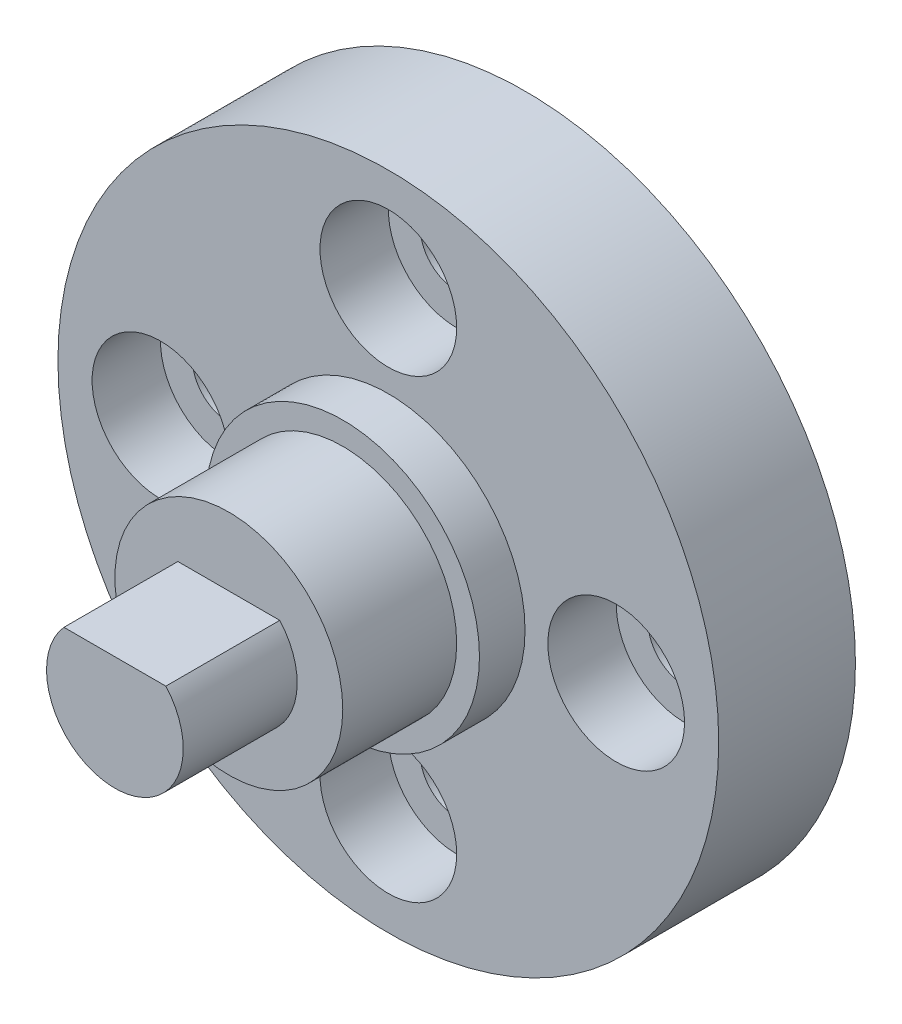
ISO-10303-21;
HEADER;
FILE_DESCRIPTION(('STEP AP214'),'2;1');
FILE_NAME('part.step','',(''),(''),'','','');
FILE_SCHEMA(('AUTOMOTIVE_DESIGN { 1 0 10303 214 1 1 1 1 }'));
ENDSEC;
DATA;
#1=APPLICATION_CONTEXT('core data for automotive mechanical design processes');
#2=APPLICATION_PROTOCOL_DEFINITION('international standard','automotive_design',2000,#1);
#3=PRODUCT_CONTEXT('',#1,'mechanical');
#4=PRODUCT('Part','Part','',(#3));
#5=PRODUCT_RELATED_PRODUCT_CATEGORY('part','',(#4));
#6=PRODUCT_DEFINITION_FORMATION('','',#4);
#7=PRODUCT_DEFINITION_CONTEXT('part definition',#1,'design');
#8=PRODUCT_DEFINITION('design','',#6,#7);
#9=PRODUCT_DEFINITION_SHAPE('','',#8);
#10=(LENGTH_UNIT() NAMED_UNIT(*) SI_UNIT(.MILLI.,.METRE.));
#11=(NAMED_UNIT(*) PLANE_ANGLE_UNIT() SI_UNIT($,.RADIAN.));
#12=(NAMED_UNIT(*) SI_UNIT($,.STERADIAN.) SOLID_ANGLE_UNIT());
#13=UNCERTAINTY_MEASURE_WITH_UNIT(LENGTH_MEASURE(1.E-05),#10,'distance_accuracy_value','');
#14=(GEOMETRIC_REPRESENTATION_CONTEXT(3) GLOBAL_UNCERTAINTY_ASSIGNED_CONTEXT((#13)) GLOBAL_UNIT_ASSIGNED_CONTEXT((#10,
#11,#12)) REPRESENTATION_CONTEXT('',''));
#15=CARTESIAN_POINT('',(0.,0.,0.));
#16=DIRECTION('',(0.,0.,1.));
#17=DIRECTION('',(1.,0.,0.));
#18=AXIS2_PLACEMENT_3D('',#15,#16,#17);
#19=CARTESIAN_POINT('',(0.,10.,6.));
#20=DIRECTION('',(0.,0.,-1.));
#21=DIRECTION('',(-1.,0.,0.));
#22=AXIS2_PLACEMENT_3D('',#19,#20,#21);
#23=CYLINDRICAL_SURFACE('',#22,1.6);
#24=CARTESIAN_POINT('',(0.,10.,0.));
#25=DIRECTION('',(0.,0.,1.));
#26=DIRECTION('',(1.,0.,0.));
#27=AXIS2_PLACEMENT_3D('',#24,#25,#26);
#28=CIRCLE('',#27,1.6);
#29=CARTESIAN_POINT('',(1.6,10.,0.));
#30=VERTEX_POINT('',#29);
#31=EDGE_CURVE('E11',#30,#30,#28,.T.);
#32=ORIENTED_EDGE('',*,*,#31,.F.);
#33=EDGE_LOOP('',(#32));
#34=FACE_BOUND('',#33,.T.);
#35=CARTESIAN_POINT('',(0.,10.,3.));
#36=DIRECTION('',(0.,0.,1.));
#37=DIRECTION('',(1.,0.,0.));
#38=AXIS2_PLACEMENT_3D('',#35,#36,#37);
#39=CIRCLE('',#38,1.6);
#40=CARTESIAN_POINT('',(1.6,10.,3.));
#41=VERTEX_POINT('',#40);
#42=EDGE_CURVE('E24',#41,#41,#39,.T.);
#43=ORIENTED_EDGE('',*,*,#42,.T.);
#44=EDGE_LOOP('',(#43));
#45=FACE_BOUND('',#44,.T.);
#46=ADVANCED_FACE('F17',(#34,#45),#23,.F.);
#47=CARTESIAN_POINT('',(10.,0.,6.));
#48=DIRECTION('',(0.,0.,-1.));
#49=DIRECTION('',(-1.,0.,0.));
#50=AXIS2_PLACEMENT_3D('',#47,#48,#49);
#51=CYLINDRICAL_SURFACE('',#50,1.6);
#52=CARTESIAN_POINT('',(10.,0.,0.));
#53=DIRECTION('',(0.,0.,1.));
#54=DIRECTION('',(1.,0.,0.));
#55=AXIS2_PLACEMENT_3D('',#52,#53,#54);
#56=CIRCLE('',#55,1.6);
#57=CARTESIAN_POINT('',(11.6,0.,0.));
#58=VERTEX_POINT('',#57);
#59=EDGE_CURVE('E119',#58,#58,#56,.T.);
#60=ORIENTED_EDGE('',*,*,#59,.F.);
#61=EDGE_LOOP('',(#60));
#62=FACE_BOUND('',#61,.T.);
#63=CARTESIAN_POINT('',(10.,0.,3.));
#64=DIRECTION('',(0.,0.,1.));
#65=DIRECTION('',(1.,0.,0.));
#66=AXIS2_PLACEMENT_3D('',#63,#64,#65);
#67=CIRCLE('',#66,1.6);
#68=CARTESIAN_POINT('',(11.6,0.,3.));
#69=VERTEX_POINT('',#68);
#70=EDGE_CURVE('E116',#69,#69,#67,.T.);
#71=ORIENTED_EDGE('',*,*,#70,.T.);
#72=EDGE_LOOP('',(#71));
#73=FACE_BOUND('',#72,.T.);
#74=ADVANCED_FACE('F197',(#62,#73),#51,.F.);
#75=CARTESIAN_POINT('',(0.,-10.,6.));
#76=DIRECTION('',(0.,0.,-1.));
#77=DIRECTION('',(-1.,0.,0.));
#78=AXIS2_PLACEMENT_3D('',#75,#76,#77);
#79=CYLINDRICAL_SURFACE('',#78,1.6);
#80=CARTESIAN_POINT('',(0.,-10.,0.));
#81=DIRECTION('',(0.,0.,1.));
#82=DIRECTION('',(1.,0.,0.));
#83=AXIS2_PLACEMENT_3D('',#80,#81,#82);
#84=CIRCLE('',#83,1.6);
#85=CARTESIAN_POINT('',(1.6,-10.,0.));
#86=VERTEX_POINT('',#85);
#87=EDGE_CURVE('E113',#86,#86,#84,.T.);
#88=ORIENTED_EDGE('',*,*,#87,.F.);
#89=EDGE_LOOP('',(#88));
#90=FACE_BOUND('',#89,.T.);
#91=CARTESIAN_POINT('',(0.,-10.,3.));
#92=DIRECTION('',(0.,0.,1.));
#93=DIRECTION('',(1.,0.,0.));
#94=AXIS2_PLACEMENT_3D('',#91,#92,#93);
#95=CIRCLE('',#94,1.6);
#96=CARTESIAN_POINT('',(1.6,-10.,3.));
#97=VERTEX_POINT('',#96);
#98=EDGE_CURVE('E110',#97,#97,#95,.T.);
#99=ORIENTED_EDGE('',*,*,#98,.T.);
#100=EDGE_LOOP('',(#99));
#101=FACE_BOUND('',#100,.T.);
#102=ADVANCED_FACE('F174',(#90,#101),#79,.F.);
#103=CARTESIAN_POINT('',(-10.,0.,6.));
#104=DIRECTION('',(0.,0.,-1.));
#105=DIRECTION('',(-1.,0.,0.));
#106=AXIS2_PLACEMENT_3D('',#103,#104,#105);
#107=CYLINDRICAL_SURFACE('',#106,1.6);
#108=CARTESIAN_POINT('',(-10.,0.,0.));
#109=DIRECTION('',(0.,0.,1.));
#110=DIRECTION('',(1.,0.,0.));
#111=AXIS2_PLACEMENT_3D('',#108,#109,#110);
#112=CIRCLE('',#111,1.6);
#113=CARTESIAN_POINT('',(-8.4,0.,0.));
#114=VERTEX_POINT('',#113);
#115=EDGE_CURVE('E107',#114,#114,#112,.T.);
#116=ORIENTED_EDGE('',*,*,#115,.F.);
#117=EDGE_LOOP('',(#116));
#118=FACE_BOUND('',#117,.T.);
#119=CARTESIAN_POINT('',(-10.,0.,3.));
#120=DIRECTION('',(0.,0.,1.));
#121=DIRECTION('',(1.,0.,0.));
#122=AXIS2_PLACEMENT_3D('',#119,#120,#121);
#123=CIRCLE('',#122,1.6);
#124=CARTESIAN_POINT('',(-8.4,0.,3.));
#125=VERTEX_POINT('',#124);
#126=EDGE_CURVE('E104',#125,#125,#123,.T.);
#127=ORIENTED_EDGE('',*,*,#126,.T.);
#128=EDGE_LOOP('',(#127));
#129=FACE_BOUND('',#128,.T.);
#130=ADVANCED_FACE('F142',(#118,#129),#107,.F.);
#131=CARTESIAN_POINT('',(0.,0.,6.));
#132=DIRECTION('',(0.,0.,1.));
#133=DIRECTION('',(1.,0.,0.));
#134=AXIS2_PLACEMENT_3D('',#131,#132,#133);
#135=PLANE('',#134);
#136=CARTESIAN_POINT('',(0.,10.,6.));
#137=DIRECTION('',(0.,0.,1.));
#138=DIRECTION('',(1.,0.,0.));
#139=AXIS2_PLACEMENT_3D('',#136,#137,#138);
#140=CIRCLE('',#139,3.);
#141=CARTESIAN_POINT('',(3.,10.,6.));
#142=VERTEX_POINT('',#141);
#143=EDGE_CURVE('E101',#142,#142,#140,.T.);
#144=ORIENTED_EDGE('',*,*,#143,.F.);
#145=EDGE_LOOP('',(#144));
#146=FACE_BOUND('',#145,.T.);
#147=CARTESIAN_POINT('',(10.,0.,6.));
#148=DIRECTION('',(0.,0.,1.));
#149=DIRECTION('',(1.,0.,0.));
#150=AXIS2_PLACEMENT_3D('',#147,#148,#149);
#151=CIRCLE('',#150,3.);
#152=CARTESIAN_POINT('',(13.,0.,6.));
#153=VERTEX_POINT('',#152);
#154=EDGE_CURVE('E98',#153,#153,#151,.T.);
#155=ORIENTED_EDGE('',*,*,#154,.F.);
#156=EDGE_LOOP('',(#155));
#157=FACE_BOUND('',#156,.T.);
#158=CARTESIAN_POINT('',(0.,-10.,6.));
#159=DIRECTION('',(0.,0.,1.));
#160=DIRECTION('',(1.,0.,0.));
#161=AXIS2_PLACEMENT_3D('',#158,#159,#160);
#162=CIRCLE('',#161,3.);
#163=CARTESIAN_POINT('',(3.,-10.,6.));
#164=VERTEX_POINT('',#163);
#165=EDGE_CURVE('E95',#164,#164,#162,.T.);
#166=ORIENTED_EDGE('',*,*,#165,.F.);
#167=EDGE_LOOP('',(#166));
#168=FACE_BOUND('',#167,.T.);
#169=CARTESIAN_POINT('',(-10.,0.,6.));
#170=DIRECTION('',(0.,0.,1.));
#171=DIRECTION('',(1.,0.,0.));
#172=AXIS2_PLACEMENT_3D('',#169,#170,#171);
#173=CIRCLE('',#172,3.);
#174=CARTESIAN_POINT('',(-7.,0.,6.));
#175=VERTEX_POINT('',#174);
#176=EDGE_CURVE('E92',#175,#175,#173,.T.);
#177=ORIENTED_EDGE('',*,*,#176,.F.);
#178=EDGE_LOOP('',(#177));
#179=FACE_BOUND('',#178,.T.);
#180=CARTESIAN_POINT('',(0.,0.,6.));
#181=DIRECTION('',(0.,0.,1.));
#182=DIRECTION('',(1.,0.,0.));
#183=AXIS2_PLACEMENT_3D('',#180,#181,#182);
#184=CIRCLE('',#183,6.);
#185=CARTESIAN_POINT('',(6.,0.,6.));
#186=VERTEX_POINT('',#185);
#187=EDGE_CURVE('E89',#186,#186,#184,.T.);
#188=ORIENTED_EDGE('',*,*,#187,.F.);
#189=EDGE_LOOP('',(#188));
#190=FACE_BOUND('',#189,.T.);
#191=CARTESIAN_POINT('',(0.,0.,6.));
#192=DIRECTION('',(0.,0.,1.));
#193=DIRECTION('',(1.,0.,0.));
#194=AXIS2_PLACEMENT_3D('',#191,#192,#193);
#195=CIRCLE('',#194,14.5);
#196=CARTESIAN_POINT('',(14.5,0.,6.));
#197=VERTEX_POINT('',#196);
#198=EDGE_CURVE('E86',#197,#197,#195,.T.);
#199=ORIENTED_EDGE('',*,*,#198,.T.);
#200=EDGE_LOOP('',(#199));
#201=FACE_BOUND('',#200,.T.);
#202=ADVANCED_FACE('F138',(#146,#157,#168,#179,#190,#201),#135,.T.);
#203=CARTESIAN_POINT('',(0.,0.,0.));
#204=DIRECTION('',(0.,0.,1.));
#205=DIRECTION('',(1.,0.,0.));
#206=AXIS2_PLACEMENT_3D('',#203,#204,#205);
#207=PLANE('',#206);
#208=CARTESIAN_POINT('',(0.,0.,0.));
#209=DIRECTION('',(0.,0.,1.));
#210=DIRECTION('',(1.,0.,0.));
#211=AXIS2_PLACEMENT_3D('',#208,#209,#210);
#212=CIRCLE('',#211,14.5);
#213=CARTESIAN_POINT('',(14.5,0.,0.));
#214=VERTEX_POINT('',#213);
#215=EDGE_CURVE('E83',#214,#214,#212,.T.);
#216=ORIENTED_EDGE('',*,*,#215,.F.);
#217=EDGE_LOOP('',(#216));
#218=FACE_BOUND('',#217,.T.);
#219=ORIENTED_EDGE('',*,*,#31,.T.);
#220=EDGE_LOOP('',(#219));
#221=FACE_BOUND('',#220,.T.);
#222=ORIENTED_EDGE('',*,*,#59,.T.);
#223=EDGE_LOOP('',(#222));
#224=FACE_BOUND('',#223,.T.);
#225=ORIENTED_EDGE('',*,*,#87,.T.);
#226=EDGE_LOOP('',(#225));
#227=FACE_BOUND('',#226,.T.);
#228=ORIENTED_EDGE('',*,*,#115,.T.);
#229=EDGE_LOOP('',(#228));
#230=FACE_BOUND('',#229,.T.);
#231=ADVANCED_FACE('F141',(#218,#221,#224,#227,#230),#207,.F.);
#232=CARTESIAN_POINT('',(0.,0.,6.));
#233=DIRECTION('',(0.,0.,-1.));
#234=DIRECTION('',(-1.,0.,0.));
#235=AXIS2_PLACEMENT_3D('',#232,#233,#234);
#236=CYLINDRICAL_SURFACE('',#235,14.5);
#237=ORIENTED_EDGE('',*,*,#198,.F.);
#238=EDGE_LOOP('',(#237));
#239=FACE_BOUND('',#238,.T.);
#240=ORIENTED_EDGE('',*,*,#215,.T.);
#241=EDGE_LOOP('',(#240));
#242=FACE_BOUND('',#241,.T.);
#243=ADVANCED_FACE('F154',(#239,#242),#236,.T.);
#244=CARTESIAN_POINT('',(0.,0.,8.));
#245=DIRECTION('',(0.,0.,-1.));
#246=DIRECTION('',(-1.,0.,0.));
#247=AXIS2_PLACEMENT_3D('',#244,#245,#246);
#248=CYLINDRICAL_SURFACE('',#247,6.);
#249=CARTESIAN_POINT('',(0.,0.,8.));
#250=DIRECTION('',(0.,0.,1.));
#251=DIRECTION('',(1.,0.,0.));
#252=AXIS2_PLACEMENT_3D('',#249,#250,#251);
#253=CIRCLE('',#252,6.);
#254=CARTESIAN_POINT('',(6.,0.,8.));
#255=VERTEX_POINT('',#254);
#256=EDGE_CURVE('E80',#255,#255,#253,.T.);
#257=ORIENTED_EDGE('',*,*,#256,.F.);
#258=EDGE_LOOP('',(#257));
#259=FACE_BOUND('',#258,.T.);
#260=ORIENTED_EDGE('',*,*,#187,.T.);
#261=EDGE_LOOP('',(#260));
#262=FACE_BOUND('',#261,.T.);
#263=ADVANCED_FACE('F157',(#259,#262),#248,.T.);
#264=CARTESIAN_POINT('',(0.,0.,8.));
#265=DIRECTION('',(0.,0.,1.));
#266=DIRECTION('',(1.,0.,0.));
#267=AXIS2_PLACEMENT_3D('',#264,#265,#266);
#268=PLANE('',#267);
#269=CARTESIAN_POINT('',(0.,0.,8.));
#270=DIRECTION('',(0.,0.,1.));
#271=DIRECTION('',(1.,0.,0.));
#272=AXIS2_PLACEMENT_3D('',#269,#270,#271);
#273=CIRCLE('',#272,5.);
#274=CARTESIAN_POINT('',(5.,0.,8.));
#275=VERTEX_POINT('',#274);
#276=EDGE_CURVE('E77',#275,#275,#273,.T.);
#277=ORIENTED_EDGE('',*,*,#276,.F.);
#278=EDGE_LOOP('',(#277));
#279=FACE_BOUND('',#278,.T.);
#280=ORIENTED_EDGE('',*,*,#256,.T.);
#281=EDGE_LOOP('',(#280));
#282=FACE_BOUND('',#281,.T.);
#283=ADVANCED_FACE('F212',(#279,#282),#268,.T.);
#284=CARTESIAN_POINT('',(0.,0.,13.));
#285=DIRECTION('',(0.,0.,-1.));
#286=DIRECTION('',(-1.,0.,0.));
#287=AXIS2_PLACEMENT_3D('',#284,#285,#286);
#288=CYLINDRICAL_SURFACE('',#287,5.);
#289=CARTESIAN_POINT('',(0.,0.,13.));
#290=DIRECTION('',(0.,0.,1.));
#291=DIRECTION('',(1.,0.,0.));
#292=AXIS2_PLACEMENT_3D('',#289,#290,#291);
#293=CIRCLE('',#292,5.);
#294=CARTESIAN_POINT('',(5.,0.,13.));
#295=VERTEX_POINT('',#294);
#296=EDGE_CURVE('E74',#295,#295,#293,.T.);
#297=ORIENTED_EDGE('',*,*,#296,.F.);
#298=EDGE_LOOP('',(#297));
#299=FACE_BOUND('',#298,.T.);
#300=ORIENTED_EDGE('',*,*,#276,.T.);
#301=EDGE_LOOP('',(#300));
#302=FACE_BOUND('',#301,.T.);
#303=ADVANCED_FACE('F194',(#299,#302),#288,.T.);
#304=CARTESIAN_POINT('',(0.,0.,13.));
#305=DIRECTION('',(0.,0.,1.));
#306=DIRECTION('',(1.,0.,0.));
#307=AXIS2_PLACEMENT_3D('',#304,#305,#306);
#308=PLANE('',#307);
#309=CARTESIAN_POINT('',(0.,0.,13.));
#310=DIRECTION('',(0.,0.,1.));
#311=DIRECTION('',(1.,0.,0.));
#312=AXIS2_PLACEMENT_3D('',#309,#310,#311);
#313=CIRCLE('',#312,3.);
#314=CARTESIAN_POINT('',(-2.23606797749979,2.,13.));
#315=VERTEX_POINT('',#314);
#316=CARTESIAN_POINT('',(2.23606797749979,2.,13.));
#317=VERTEX_POINT('',#316);
#318=EDGE_CURVE('E30',#315,#317,#313,.T.);
#319=ORIENTED_EDGE('',*,*,#318,.F.);
#320=DIRECTION('',(-1.,0.,0.));
#321=VECTOR('',#320,1.);
#322=CARTESIAN_POINT('',(2.23606797749979,2.,13.));
#323=LINE('',#322,#321);
#324=EDGE_CURVE('E34',#317,#315,#323,.T.);
#325=ORIENTED_EDGE('',*,*,#324,.F.);
#326=EDGE_LOOP('',(#319,#325));
#327=FACE_BOUND('',#326,.T.);
#328=ORIENTED_EDGE('',*,*,#296,.T.);
#329=EDGE_LOOP('',(#328));
#330=FACE_BOUND('',#329,.T.);
#331=ADVANCED_FACE('F188',(#327,#330),#308,.T.);
#332=CARTESIAN_POINT('',(-10.,0.,3.));
#333=DIRECTION('',(0.,0.,1.));
#334=DIRECTION('',(1.,0.,0.));
#335=AXIS2_PLACEMENT_3D('',#332,#333,#334);
#336=CYLINDRICAL_SURFACE('',#335,3.);
#337=CARTESIAN_POINT('',(-10.,0.,3.));
#338=DIRECTION('',(0.,0.,1.));
#339=DIRECTION('',(1.,0.,0.));
#340=AXIS2_PLACEMENT_3D('',#337,#338,#339);
#341=CIRCLE('',#340,3.);
#342=CARTESIAN_POINT('',(-7.,0.,3.));
#343=VERTEX_POINT('',#342);
#344=EDGE_CURVE('E69',#343,#343,#341,.T.);
#345=ORIENTED_EDGE('',*,*,#344,.F.);
#346=EDGE_LOOP('',(#345));
#347=FACE_BOUND('',#346,.T.);
#348=ORIENTED_EDGE('',*,*,#176,.T.);
#349=EDGE_LOOP('',(#348));
#350=FACE_BOUND('',#349,.T.);
#351=ADVANCED_FACE('F182',(#347,#350),#336,.F.);
#352=CARTESIAN_POINT('',(-10.,0.,3.));
#353=DIRECTION('',(0.,0.,1.));
#354=DIRECTION('',(1.,0.,0.));
#355=AXIS2_PLACEMENT_3D('',#352,#353,#354);
#356=PLANE('',#355);
#357=ORIENTED_EDGE('',*,*,#126,.F.);
#358=EDGE_LOOP('',(#357));
#359=FACE_BOUND('',#358,.T.);
#360=ORIENTED_EDGE('',*,*,#344,.T.);
#361=EDGE_LOOP('',(#360));
#362=FACE_BOUND('',#361,.T.);
#363=ADVANCED_FACE('F178',(#359,#362),#356,.T.);
#364=CARTESIAN_POINT('',(0.,-10.,3.));
#365=DIRECTION('',(0.,0.,1.));
#366=DIRECTION('',(1.,0.,0.));
#367=AXIS2_PLACEMENT_3D('',#364,#365,#366);
#368=CYLINDRICAL_SURFACE('',#367,3.);
#369=CARTESIAN_POINT('',(0.,-10.,3.));
#370=DIRECTION('',(0.,0.,1.));
#371=DIRECTION('',(1.,0.,0.));
#372=AXIS2_PLACEMENT_3D('',#369,#370,#371);
#373=CIRCLE('',#372,3.);
#374=CARTESIAN_POINT('',(3.,-10.,3.));
#375=VERTEX_POINT('',#374);
#376=EDGE_CURVE('E66',#375,#375,#373,.T.);
#377=ORIENTED_EDGE('',*,*,#376,.F.);
#378=EDGE_LOOP('',(#377));
#379=FACE_BOUND('',#378,.T.);
#380=ORIENTED_EDGE('',*,*,#165,.T.);
#381=EDGE_LOOP('',(#380));
#382=FACE_BOUND('',#381,.T.);
#383=ADVANCED_FACE('F181',(#379,#382),#368,.F.);
#384=CARTESIAN_POINT('',(0.,-10.,3.));
#385=DIRECTION('',(0.,0.,1.));
#386=DIRECTION('',(1.,0.,0.));
#387=AXIS2_PLACEMENT_3D('',#384,#385,#386);
#388=PLANE('',#387);
#389=ORIENTED_EDGE('',*,*,#98,.F.);
#390=EDGE_LOOP('',(#389));
#391=FACE_BOUND('',#390,.T.);
#392=ORIENTED_EDGE('',*,*,#376,.T.);
#393=EDGE_LOOP('',(#392));
#394=FACE_BOUND('',#393,.T.);
#395=ADVANCED_FACE('F261',(#391,#394),#388,.T.);
#396=CARTESIAN_POINT('',(10.,0.,3.));
#397=DIRECTION('',(0.,0.,1.));
#398=DIRECTION('',(1.,0.,0.));
#399=AXIS2_PLACEMENT_3D('',#396,#397,#398);
#400=CYLINDRICAL_SURFACE('',#399,3.);
#401=CARTESIAN_POINT('',(10.,0.,3.));
#402=DIRECTION('',(0.,0.,1.));
#403=DIRECTION('',(1.,0.,0.));
#404=AXIS2_PLACEMENT_3D('',#401,#402,#403);
#405=CIRCLE('',#404,3.);
#406=CARTESIAN_POINT('',(13.,0.,3.));
#407=VERTEX_POINT('',#406);
#408=EDGE_CURVE('E63',#407,#407,#405,.T.);
#409=ORIENTED_EDGE('',*,*,#408,.F.);
#410=EDGE_LOOP('',(#409));
#411=FACE_BOUND('',#410,.T.);
#412=ORIENTED_EDGE('',*,*,#154,.T.);
#413=EDGE_LOOP('',(#412));
#414=FACE_BOUND('',#413,.T.);
#415=ADVANCED_FACE('F271',(#411,#414),#400,.F.);
#416=CARTESIAN_POINT('',(10.,0.,3.));
#417=DIRECTION('',(0.,0.,1.));
#418=DIRECTION('',(1.,0.,0.));
#419=AXIS2_PLACEMENT_3D('',#416,#417,#418);
#420=PLANE('',#419);
#421=ORIENTED_EDGE('',*,*,#70,.F.);
#422=EDGE_LOOP('',(#421));
#423=FACE_BOUND('',#422,.T.);
#424=ORIENTED_EDGE('',*,*,#408,.T.);
#425=EDGE_LOOP('',(#424));
#426=FACE_BOUND('',#425,.T.);
#427=ADVANCED_FACE('F134',(#423,#426),#420,.T.);
#428=CARTESIAN_POINT('',(0.,10.,3.));
#429=DIRECTION('',(0.,0.,1.));
#430=DIRECTION('',(1.,0.,0.));
#431=AXIS2_PLACEMENT_3D('',#428,#429,#430);
#432=CYLINDRICAL_SURFACE('',#431,3.);
#433=CARTESIAN_POINT('',(0.,10.,3.));
#434=DIRECTION('',(0.,0.,1.));
#435=DIRECTION('',(1.,0.,0.));
#436=AXIS2_PLACEMENT_3D('',#433,#434,#435);
#437=CIRCLE('',#436,3.);
#438=CARTESIAN_POINT('',(3.,10.,3.));
#439=VERTEX_POINT('',#438);
#440=EDGE_CURVE('E60',#439,#439,#437,.T.);
#441=ORIENTED_EDGE('',*,*,#440,.F.);
#442=EDGE_LOOP('',(#441));
#443=FACE_BOUND('',#442,.T.);
#444=ORIENTED_EDGE('',*,*,#143,.T.);
#445=EDGE_LOOP('',(#444));
#446=FACE_BOUND('',#445,.T.);
#447=ADVANCED_FACE('F128',(#443,#446),#432,.F.);
#448=CARTESIAN_POINT('',(0.,10.,3.));
#449=DIRECTION('',(0.,0.,1.));
#450=DIRECTION('',(1.,0.,0.));
#451=AXIS2_PLACEMENT_3D('',#448,#449,#450);
#452=PLANE('',#451);
#453=ORIENTED_EDGE('',*,*,#42,.F.);
#454=EDGE_LOOP('',(#453));
#455=FACE_BOUND('',#454,.T.);
#456=ORIENTED_EDGE('',*,*,#440,.T.);
#457=EDGE_LOOP('',(#456));
#458=FACE_BOUND('',#457,.T.);
#459=ADVANCED_FACE('F125',(#455,#458),#452,.T.);
#460=CARTESIAN_POINT('',(0.,0.,18.));
#461=DIRECTION('',(0.,0.,-1.));
#462=DIRECTION('',(-1.,0.,0.));
#463=AXIS2_PLACEMENT_3D('',#460,#461,#462);
#464=CYLINDRICAL_SURFACE('',#463,3.);
#465=ORIENTED_EDGE('',*,*,#318,.T.);
#466=DIRECTION('',(0.,0.,-1.));
#467=VECTOR('',#466,1.);
#468=CARTESIAN_POINT('',(2.23606797749979,2.,18.));
#469=LINE('',#468,#467);
#470=CARTESIAN_POINT('',(2.23606797749979,2.,18.));
#471=VERTEX_POINT('',#470);
#472=EDGE_CURVE('E47',#471,#317,#469,.T.);
#473=ORIENTED_EDGE('',*,*,#472,.F.);
#474=CARTESIAN_POINT('',(0.,0.,18.));
#475=DIRECTION('',(0.,0.,1.));
#476=DIRECTION('',(1.,0.,0.));
#477=AXIS2_PLACEMENT_3D('',#474,#475,#476);
#478=CIRCLE('',#477,3.);
#479=CARTESIAN_POINT('',(-2.23606797749979,2.,18.));
#480=VERTEX_POINT('',#479);
#481=EDGE_CURVE('E42',#480,#471,#478,.T.);
#482=ORIENTED_EDGE('',*,*,#481,.F.);
#483=DIRECTION('',(0.,0.,-1.));
#484=VECTOR('',#483,1.);
#485=CARTESIAN_POINT('',(-2.23606797749979,2.,18.));
#486=LINE('',#485,#484);
#487=EDGE_CURVE('E45',#480,#315,#486,.T.);
#488=ORIENTED_EDGE('',*,*,#487,.T.);
#489=EDGE_LOOP('',(#465,#473,#482,#488));
#490=FACE_BOUND('',#489,.T.);
#491=ADVANCED_FACE('F44',(#490),#464,.T.);
#492=CARTESIAN_POINT('',(2.23606797749979,2.,18.));
#493=DIRECTION('',(0.,-1.,0.));
#494=DIRECTION('',(0.,0.,-1.));
#495=AXIS2_PLACEMENT_3D('',#492,#493,#494);
#496=PLANE('',#495);
#497=ORIENTED_EDGE('',*,*,#324,.T.);
#498=ORIENTED_EDGE('',*,*,#487,.F.);
#499=DIRECTION('',(-1.,0.,0.));
#500=VECTOR('',#499,1.);
#501=CARTESIAN_POINT('',(2.23606797749979,2.,18.));
#502=LINE('',#501,#500);
#503=EDGE_CURVE('E54',#471,#480,#502,.T.);
#504=ORIENTED_EDGE('',*,*,#503,.F.);
#505=ORIENTED_EDGE('',*,*,#472,.T.);
#506=EDGE_LOOP('',(#497,#498,#504,#505));
#507=FACE_BOUND('',#506,.T.);
#508=ADVANCED_FACE('F53',(#507),#496,.F.);
#509=CARTESIAN_POINT('',(0.,0.,18.));
#510=DIRECTION('',(0.,0.,1.));
#511=DIRECTION('',(1.,0.,0.));
#512=AXIS2_PLACEMENT_3D('',#509,#510,#511);
#513=PLANE('',#512);
#514=ORIENTED_EDGE('',*,*,#481,.T.);
#515=ORIENTED_EDGE('',*,*,#503,.T.);
#516=EDGE_LOOP('',(#514,#515));
#517=FACE_BOUND('',#516,.T.);
#518=ADVANCED_FACE('F56',(#517),#513,.T.);
#519=CLOSED_SHELL('',(#46,#74,#102,#130,#202,#231,#243,#263,#283,#303,#331,#351,#363,#383,#395,
#415,#427,#447,#459,#491,#508,#518));
#520=MANIFOLD_SOLID_BREP('B1',#519);
#521=ADVANCED_BREP_SHAPE_REPRESENTATION('',(#18,#520),#14);
#522=SHAPE_DEFINITION_REPRESENTATION(#9,#521);
ENDSEC;
END-ISO-10303-21;
